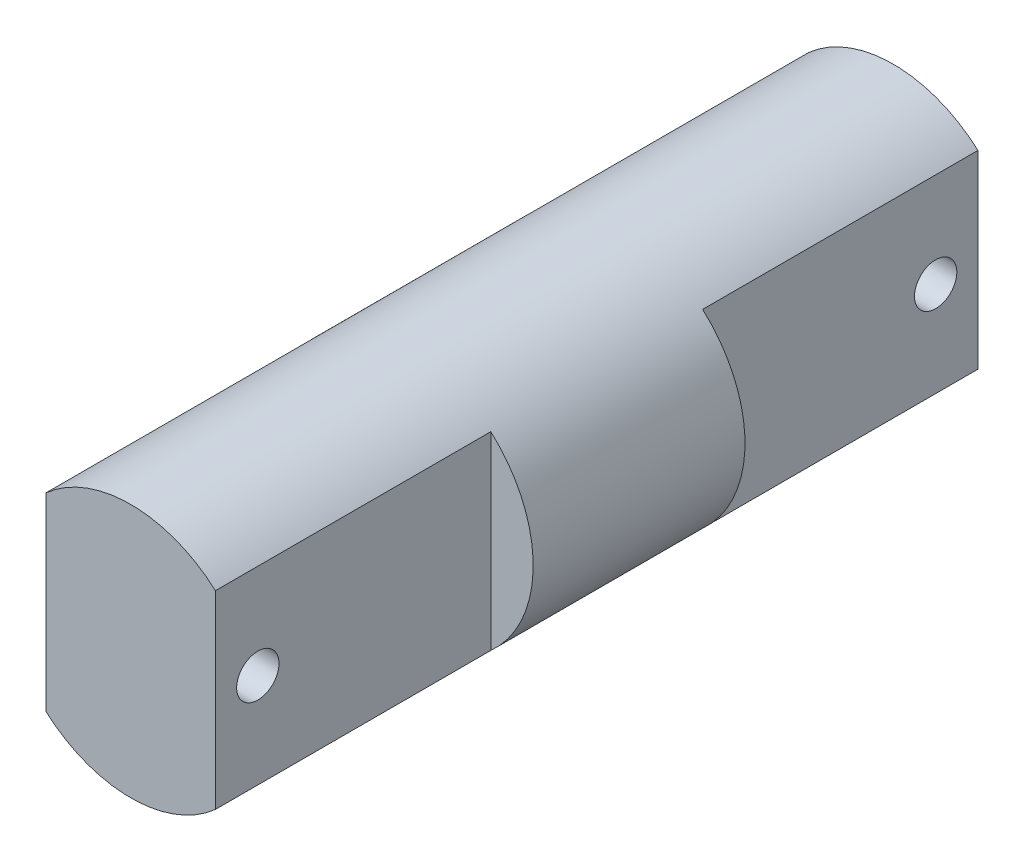
ISO-10303-21;
HEADER;
FILE_DESCRIPTION(('STEP AP214'),'2;1');
FILE_NAME('part.step','',(''),(''),'','','');
FILE_SCHEMA(('AUTOMOTIVE_DESIGN { 1 0 10303 214 1 1 1 1 }'));
ENDSEC;
DATA;
#1=APPLICATION_CONTEXT('core data for automotive mechanical design processes');
#2=APPLICATION_PROTOCOL_DEFINITION('international standard','automotive_design',2000,#1);
#3=PRODUCT_CONTEXT('',#1,'mechanical');
#4=PRODUCT('Part','Part','',(#3));
#5=PRODUCT_RELATED_PRODUCT_CATEGORY('part','',(#4));
#6=PRODUCT_DEFINITION_FORMATION('','',#4);
#7=PRODUCT_DEFINITION_CONTEXT('part definition',#1,'design');
#8=PRODUCT_DEFINITION('design','',#6,#7);
#9=PRODUCT_DEFINITION_SHAPE('','',#8);
#10=(LENGTH_UNIT() NAMED_UNIT(*) SI_UNIT(.MILLI.,.METRE.));
#11=(NAMED_UNIT(*) PLANE_ANGLE_UNIT() SI_UNIT($,.RADIAN.));
#12=(NAMED_UNIT(*) SI_UNIT($,.STERADIAN.) SOLID_ANGLE_UNIT());
#13=UNCERTAINTY_MEASURE_WITH_UNIT(LENGTH_MEASURE(1.E-05),#10,'distance_accuracy_value','');
#14=(GEOMETRIC_REPRESENTATION_CONTEXT(3) GLOBAL_UNCERTAINTY_ASSIGNED_CONTEXT((#13)) GLOBAL_UNIT_ASSIGNED_CONTEXT((#10,
#11,#12)) REPRESENTATION_CONTEXT('',''));
#15=CARTESIAN_POINT('',(0.,0.,0.));
#16=DIRECTION('',(0.,0.,1.));
#17=DIRECTION('',(1.,0.,0.));
#18=AXIS2_PLACEMENT_3D('',#15,#16,#17);
#19=CARTESIAN_POINT('',(0.,0.,-228.6));
#20=DIRECTION('',(0.,0.,1.));
#21=DIRECTION('',(1.,0.,0.));
#22=AXIS2_PLACEMENT_3D('',#19,#20,#21);
#23=CYLINDRICAL_SURFACE('',#22,38.1);
#24=CARTESIAN_POINT('',(0.,0.,0.));
#25=DIRECTION('',(0.,0.,1.));
#26=DIRECTION('',(1.,0.,0.));
#27=AXIS2_PLACEMENT_3D('',#24,#25,#26);
#28=CIRCLE('',#27,38.1);
#29=CARTESIAN_POINT('',(-25.4,-28.3980633142473,0.));
#30=VERTEX_POINT('',#29);
#31=CARTESIAN_POINT('',(25.4,-28.3980633142473,0.));
#32=VERTEX_POINT('',#31);
#33=EDGE_CURVE('E163',#30,#32,#28,.T.);
#34=ORIENTED_EDGE('',*,*,#33,.F.);
#35=DIRECTION('',(0.,0.,1.));
#36=VECTOR('',#35,1.);
#37=CARTESIAN_POINT('',(-25.4,-28.3980633142473,-228.6));
#38=LINE('',#37,#36);
#39=CARTESIAN_POINT('',(-25.4,-28.3980633142473,-82.55));
#40=VERTEX_POINT('',#39);
#41=EDGE_CURVE('E149',#30,#40,#38,.F.);
#42=ORIENTED_EDGE('',*,*,#41,.T.);
#43=CARTESIAN_POINT('',(0.,0.,-82.55));
#44=DIRECTION('',(0.,0.,-1.));
#45=DIRECTION('',(-1.,0.,0.));
#46=AXIS2_PLACEMENT_3D('',#43,#44,#45);
#47=CIRCLE('',#46,38.1);
#48=CARTESIAN_POINT('',(-25.4,28.3980633142473,-82.55));
#49=VERTEX_POINT('',#48);
#50=EDGE_CURVE('E182',#49,#40,#47,.F.);
#51=ORIENTED_EDGE('',*,*,#50,.F.);
#52=DIRECTION('',(0.,0.,1.));
#53=VECTOR('',#52,1.);
#54=CARTESIAN_POINT('',(-25.4,28.3980633142473,-228.6));
#55=LINE('',#54,#53);
#56=CARTESIAN_POINT('',(-25.4,28.3980633142473,0.));
#57=VERTEX_POINT('',#56);
#58=EDGE_CURVE('E145',#49,#57,#55,.T.);
#59=ORIENTED_EDGE('',*,*,#58,.T.);
#60=CARTESIAN_POINT('',(25.4,28.3980633142473,0.));
#61=VERTEX_POINT('',#60);
#62=EDGE_CURVE('E167',#61,#57,#28,.T.);
#63=ORIENTED_EDGE('',*,*,#62,.F.);
#64=DIRECTION('',(0.,0.,1.));
#65=VECTOR('',#64,1.);
#66=CARTESIAN_POINT('',(25.4,28.3980633142473,-228.6));
#67=LINE('',#66,#65);
#68=CARTESIAN_POINT('',(25.4,28.3980633142473,-82.55));
#69=VERTEX_POINT('',#68);
#70=EDGE_CURVE('E157',#69,#61,#67,.T.);
#71=ORIENTED_EDGE('',*,*,#70,.F.);
#72=CARTESIAN_POINT('',(0.,0.,-82.55));
#73=DIRECTION('',(0.,0.,1.));
#74=DIRECTION('',(1.,0.,0.));
#75=AXIS2_PLACEMENT_3D('',#72,#73,#74);
#76=CIRCLE('',#75,38.1);
#77=CARTESIAN_POINT('',(25.4,-28.3980633142473,-82.55));
#78=VERTEX_POINT('',#77);
#79=EDGE_CURVE('E174',#69,#78,#76,.F.);
#80=ORIENTED_EDGE('',*,*,#79,.T.);
#81=DIRECTION('',(0.,0.,1.));
#82=VECTOR('',#81,1.);
#83=CARTESIAN_POINT('',(25.4,-28.3980633142473,-228.6));
#84=LINE('',#83,#82);
#85=EDGE_CURVE('E160',#32,#78,#84,.F.);
#86=ORIENTED_EDGE('',*,*,#85,.F.);
#87=EDGE_LOOP('',(#34,#42,#51,#59,#63,#71,#80,#86));
#88=FACE_BOUND('',#87,.T.);
#89=CARTESIAN_POINT('',(0.,0.,-146.05));
#90=DIRECTION('',(0.,0.,-1.));
#91=DIRECTION('',(-1.,0.,0.));
#92=AXIS2_PLACEMENT_3D('',#89,#90,#91);
#93=CIRCLE('',#92,38.1);
#94=CARTESIAN_POINT('',(-25.4,28.3980633142473,-146.05));
#95=VERTEX_POINT('',#94);
#96=CARTESIAN_POINT('',(-25.4,-28.3980633142473,-146.05));
#97=VERTEX_POINT('',#96);
#98=EDGE_CURVE('E11',#95,#97,#93,.F.);
#99=ORIENTED_EDGE('',*,*,#98,.T.);
#100=DIRECTION('',(0.,0.,1.));
#101=VECTOR('',#100,1.);
#102=CARTESIAN_POINT('',(-25.4,-28.3980633142473,-228.6));
#103=LINE('',#102,#101);
#104=CARTESIAN_POINT('',(-25.4,-28.3980633142473,-228.6));
#105=VERTEX_POINT('',#104);
#106=EDGE_CURVE('E104',#97,#105,#103,.F.);
#107=ORIENTED_EDGE('',*,*,#106,.T.);
#108=CARTESIAN_POINT('',(0.,0.,-228.6));
#109=DIRECTION('',(0.,0.,1.));
#110=DIRECTION('',(1.,0.,0.));
#111=AXIS2_PLACEMENT_3D('',#108,#109,#110);
#112=CIRCLE('',#111,38.1);
#113=CARTESIAN_POINT('',(25.4,-28.3980633142473,-228.6));
#114=VERTEX_POINT('',#113);
#115=EDGE_CURVE('E62',#105,#114,#112,.T.);
#116=ORIENTED_EDGE('',*,*,#115,.T.);
#117=DIRECTION('',(0.,0.,1.));
#118=VECTOR('',#117,1.);
#119=CARTESIAN_POINT('',(25.4,-28.3980633142473,-228.6));
#120=LINE('',#119,#118);
#121=CARTESIAN_POINT('',(25.4,-28.3980633142473,-146.05));
#122=VERTEX_POINT('',#121);
#123=EDGE_CURVE('E130',#122,#114,#120,.F.);
#124=ORIENTED_EDGE('',*,*,#123,.F.);
#125=CARTESIAN_POINT('',(0.,0.,-146.05));
#126=DIRECTION('',(0.,0.,1.));
#127=DIRECTION('',(1.,0.,0.));
#128=AXIS2_PLACEMENT_3D('',#125,#126,#127);
#129=CIRCLE('',#128,38.1);
#130=CARTESIAN_POINT('',(25.4,28.3980633142473,-146.05));
#131=VERTEX_POINT('',#130);
#132=EDGE_CURVE('E189',#131,#122,#129,.F.);
#133=ORIENTED_EDGE('',*,*,#132,.F.);
#134=DIRECTION('',(0.,0.,1.));
#135=VECTOR('',#134,1.);
#136=CARTESIAN_POINT('',(25.4,28.3980633142473,-228.6));
#137=LINE('',#136,#135);
#138=CARTESIAN_POINT('',(25.4,28.3980633142473,-228.6));
#139=VERTEX_POINT('',#138);
#140=EDGE_CURVE('E127',#139,#131,#137,.T.);
#141=ORIENTED_EDGE('',*,*,#140,.F.);
#142=CARTESIAN_POINT('',(-25.4,28.3980633142473,-228.6));
#143=VERTEX_POINT('',#142);
#144=EDGE_CURVE('E119',#139,#143,#112,.T.);
#145=ORIENTED_EDGE('',*,*,#144,.T.);
#146=DIRECTION('',(0.,0.,1.));
#147=VECTOR('',#146,1.);
#148=CARTESIAN_POINT('',(-25.4,28.3980633142473,-228.6));
#149=LINE('',#148,#147);
#150=EDGE_CURVE('E54',#143,#95,#149,.T.);
#151=ORIENTED_EDGE('',*,*,#150,.T.);
#152=EDGE_LOOP('',(#99,#107,#116,#124,#133,#141,#145,#151));
#153=FACE_BOUND('',#152,.T.);
#154=ADVANCED_FACE('F39',(#88,#153),#23,.T.);
#155=CARTESIAN_POINT('',(0.,0.,-228.6));
#156=DIRECTION('',(0.,0.,1.));
#157=DIRECTION('',(1.,0.,0.));
#158=AXIS2_PLACEMENT_3D('',#155,#156,#157);
#159=PLANE('',#158);
#160=DIRECTION('',(0.,-1.,0.));
#161=VECTOR('',#160,1.);
#162=CARTESIAN_POINT('',(-25.4,0.,-228.6));
#163=LINE('',#162,#161);
#164=EDGE_CURVE('E47',#143,#105,#163,.T.);
#165=ORIENTED_EDGE('',*,*,#164,.F.);
#166=ORIENTED_EDGE('',*,*,#144,.F.);
#167=DIRECTION('',(0.,-1.,0.));
#168=VECTOR('',#167,1.);
#169=CARTESIAN_POINT('',(25.4,0.,-228.6));
#170=LINE('',#169,#168);
#171=EDGE_CURVE('E185',#139,#114,#170,.T.);
#172=ORIENTED_EDGE('',*,*,#171,.T.);
#173=ORIENTED_EDGE('',*,*,#115,.F.);
#174=EDGE_LOOP('',(#165,#166,#172,#173));
#175=FACE_BOUND('',#174,.T.);
#176=ADVANCED_FACE('F216',(#175),#159,.F.);
#177=CARTESIAN_POINT('',(0.,0.,0.));
#178=DIRECTION('',(0.,0.,1.));
#179=DIRECTION('',(1.,0.,0.));
#180=AXIS2_PLACEMENT_3D('',#177,#178,#179);
#181=PLANE('',#180);
#182=ORIENTED_EDGE('',*,*,#62,.T.);
#183=DIRECTION('',(0.,-1.,0.));
#184=VECTOR('',#183,1.);
#185=CARTESIAN_POINT('',(-25.4,0.,0.));
#186=LINE('',#185,#184);
#187=EDGE_CURVE('E178',#57,#30,#186,.T.);
#188=ORIENTED_EDGE('',*,*,#187,.T.);
#189=ORIENTED_EDGE('',*,*,#33,.T.);
#190=DIRECTION('',(0.,-1.,0.));
#191=VECTOR('',#190,1.);
#192=CARTESIAN_POINT('',(25.4,0.,0.));
#193=LINE('',#192,#191);
#194=EDGE_CURVE('E166',#61,#32,#193,.T.);
#195=ORIENTED_EDGE('',*,*,#194,.F.);
#196=EDGE_LOOP('',(#182,#188,#189,#195));
#197=FACE_BOUND('',#196,.T.);
#198=ADVANCED_FACE('F197',(#197),#181,.T.);
#199=CARTESIAN_POINT('',(50.8,-38.1,-82.55));
#200=DIRECTION('',(0.,0.,1.));
#201=DIRECTION('',(1.,0.,0.));
#202=AXIS2_PLACEMENT_3D('',#199,#200,#201);
#203=PLANE('',#202);
#204=DIRECTION('',(0.,1.,0.));
#205=VECTOR('',#204,1.);
#206=CARTESIAN_POINT('',(25.4,-38.1,-82.55));
#207=LINE('',#206,#205);
#208=EDGE_CURVE('E153',#78,#69,#207,.T.);
#209=ORIENTED_EDGE('',*,*,#208,.F.);
#210=ORIENTED_EDGE('',*,*,#79,.F.);
#211=EDGE_LOOP('',(#209,#210));
#212=FACE_BOUND('',#211,.T.);
#213=ADVANCED_FACE('F206',(#212),#203,.T.);
#214=CARTESIAN_POINT('',(25.4,0.,0.));
#215=DIRECTION('',(-1.,0.,0.));
#216=DIRECTION('',(0.,0.,1.));
#217=AXIS2_PLACEMENT_3D('',#214,#215,#216);
#218=PLANE('',#217);
#219=CARTESIAN_POINT('',(25.4,0.,-12.7));
#220=DIRECTION('',(1.,0.,0.));
#221=DIRECTION('',(0.,0.,-1.));
#222=AXIS2_PLACEMENT_3D('',#219,#220,#221);
#223=CIRCLE('',#222,6.35);
#224=CARTESIAN_POINT('',(25.4,0.,-19.05));
#225=VERTEX_POINT('',#224);
#226=EDGE_CURVE('E134',#225,#225,#223,.T.);
#227=ORIENTED_EDGE('',*,*,#226,.F.);
#228=EDGE_LOOP('',(#227));
#229=FACE_BOUND('',#228,.T.);
#230=ORIENTED_EDGE('',*,*,#85,.T.);
#231=ORIENTED_EDGE('',*,*,#208,.T.);
#232=ORIENTED_EDGE('',*,*,#70,.T.);
#233=ORIENTED_EDGE('',*,*,#194,.T.);
#234=EDGE_LOOP('',(#230,#231,#232,#233));
#235=FACE_BOUND('',#234,.T.);
#236=ADVANCED_FACE('F202',(#229,#235),#218,.F.);
#237=CARTESIAN_POINT('',(-50.8,-38.1,-82.55));
#238=DIRECTION('',(0.,0.,-1.));
#239=DIRECTION('',(-1.,0.,0.));
#240=AXIS2_PLACEMENT_3D('',#237,#238,#239);
#241=PLANE('',#240);
#242=ORIENTED_EDGE('',*,*,#50,.T.);
#243=DIRECTION('',(0.,1.,0.));
#244=VECTOR('',#243,1.);
#245=CARTESIAN_POINT('',(-25.4,-38.1,-82.55));
#246=LINE('',#245,#244);
#247=EDGE_CURVE('E138',#40,#49,#246,.T.);
#248=ORIENTED_EDGE('',*,*,#247,.T.);
#249=EDGE_LOOP('',(#242,#248));
#250=FACE_BOUND('',#249,.T.);
#251=ADVANCED_FACE('F213',(#250),#241,.F.);
#252=CARTESIAN_POINT('',(-25.4,0.,0.));
#253=DIRECTION('',(-1.,0.,0.));
#254=DIRECTION('',(0.,0.,1.));
#255=AXIS2_PLACEMENT_3D('',#252,#253,#254);
#256=PLANE('',#255);
#257=CARTESIAN_POINT('',(-25.4,0.,-12.7));
#258=DIRECTION('',(-1.,0.,0.));
#259=DIRECTION('',(0.,0.,1.));
#260=AXIS2_PLACEMENT_3D('',#257,#258,#259);
#261=CIRCLE('',#260,6.35);
#262=CARTESIAN_POINT('',(-25.4,0.,-6.35));
#263=VERTEX_POINT('',#262);
#264=EDGE_CURVE('E133',#263,#263,#261,.F.);
#265=ORIENTED_EDGE('',*,*,#264,.T.);
#266=EDGE_LOOP('',(#265));
#267=FACE_BOUND('',#266,.T.);
#268=ORIENTED_EDGE('',*,*,#187,.F.);
#269=ORIENTED_EDGE('',*,*,#58,.F.);
#270=ORIENTED_EDGE('',*,*,#247,.F.);
#271=ORIENTED_EDGE('',*,*,#41,.F.);
#272=EDGE_LOOP('',(#268,#269,#270,#271));
#273=FACE_BOUND('',#272,.T.);
#274=ADVANCED_FACE('F240',(#267,#273),#256,.T.);
#275=CARTESIAN_POINT('',(-38.101,0.,-12.7));
#276=DIRECTION('',(1.,0.,0.));
#277=DIRECTION('',(0.,0.,-1.));
#278=AXIS2_PLACEMENT_3D('',#275,#276,#277);
#279=CYLINDRICAL_SURFACE('',#278,6.35);
#280=ORIENTED_EDGE('',*,*,#264,.F.);
#281=EDGE_LOOP('',(#280));
#282=FACE_BOUND('',#281,.T.);
#283=ORIENTED_EDGE('',*,*,#226,.T.);
#284=EDGE_LOOP('',(#283));
#285=FACE_BOUND('',#284,.T.);
#286=ADVANCED_FACE('F232',(#282,#285),#279,.F.);
#287=CARTESIAN_POINT('',(50.8,-38.1,-146.05));
#288=DIRECTION('',(0.,0.,1.));
#289=DIRECTION('',(1.,0.,0.));
#290=AXIS2_PLACEMENT_3D('',#287,#288,#289);
#291=PLANE('',#290);
#292=ORIENTED_EDGE('',*,*,#132,.T.);
#293=DIRECTION('',(0.,1.,0.));
#294=VECTOR('',#293,1.);
#295=CARTESIAN_POINT('',(25.4,-38.1,-146.05));
#296=LINE('',#295,#294);
#297=EDGE_CURVE('E109',#122,#131,#296,.T.);
#298=ORIENTED_EDGE('',*,*,#297,.T.);
#299=EDGE_LOOP('',(#292,#298));
#300=FACE_BOUND('',#299,.T.);
#301=ADVANCED_FACE('F230',(#300),#291,.F.);
#302=CARTESIAN_POINT('',(25.4,0.,-228.6));
#303=DIRECTION('',(-1.,0.,0.));
#304=DIRECTION('',(0.,0.,-1.));
#305=AXIS2_PLACEMENT_3D('',#302,#303,#304);
#306=PLANE('',#305);
#307=CARTESIAN_POINT('',(25.4,0.,-215.9));
#308=DIRECTION('',(-1.,0.,0.));
#309=DIRECTION('',(0.,0.,1.));
#310=AXIS2_PLACEMENT_3D('',#307,#308,#309);
#311=CIRCLE('',#310,6.35);
#312=CARTESIAN_POINT('',(25.4,0.,-209.55));
#313=VERTEX_POINT('',#312);
#314=EDGE_CURVE('E319',#313,#313,#311,.T.);
#315=ORIENTED_EDGE('',*,*,#314,.T.);
#316=EDGE_LOOP('',(#315));
#317=FACE_BOUND('',#316,.T.);
#318=ORIENTED_EDGE('',*,*,#123,.T.);
#319=ORIENTED_EDGE('',*,*,#171,.F.);
#320=ORIENTED_EDGE('',*,*,#140,.T.);
#321=ORIENTED_EDGE('',*,*,#297,.F.);
#322=EDGE_LOOP('',(#318,#319,#320,#321));
#323=FACE_BOUND('',#322,.T.);
#324=ADVANCED_FACE('F226',(#317,#323),#306,.F.);
#325=CARTESIAN_POINT('',(-50.8,-38.1,-146.05));
#326=DIRECTION('',(0.,0.,-1.));
#327=DIRECTION('',(-1.,0.,0.));
#328=AXIS2_PLACEMENT_3D('',#325,#326,#327);
#329=PLANE('',#328);
#330=DIRECTION('',(0.,1.,0.));
#331=VECTOR('',#330,1.);
#332=CARTESIAN_POINT('',(-25.4,-38.1,-146.05));
#333=LINE('',#332,#331);
#334=EDGE_CURVE('E107',#97,#95,#333,.T.);
#335=ORIENTED_EDGE('',*,*,#334,.F.);
#336=ORIENTED_EDGE('',*,*,#98,.F.);
#337=EDGE_LOOP('',(#335,#336));
#338=FACE_BOUND('',#337,.T.);
#339=ADVANCED_FACE('F112',(#338),#329,.T.);
#340=CARTESIAN_POINT('',(-25.4,0.,-228.6));
#341=DIRECTION('',(-1.,0.,0.));
#342=DIRECTION('',(0.,0.,-1.));
#343=AXIS2_PLACEMENT_3D('',#340,#341,#342);
#344=PLANE('',#343);
#345=CARTESIAN_POINT('',(-25.4,0.,-215.9));
#346=DIRECTION('',(-1.,0.,0.));
#347=DIRECTION('',(0.,0.,1.));
#348=AXIS2_PLACEMENT_3D('',#345,#346,#347);
#349=CIRCLE('',#348,6.35);
#350=CARTESIAN_POINT('',(-25.4,0.,-209.55));
#351=VERTEX_POINT('',#350);
#352=EDGE_CURVE('E114',#351,#351,#349,.T.);
#353=ORIENTED_EDGE('',*,*,#352,.F.);
#354=EDGE_LOOP('',(#353));
#355=FACE_BOUND('',#354,.T.);
#356=ORIENTED_EDGE('',*,*,#334,.T.);
#357=ORIENTED_EDGE('',*,*,#150,.F.);
#358=ORIENTED_EDGE('',*,*,#164,.T.);
#359=ORIENTED_EDGE('',*,*,#106,.F.);
#360=EDGE_LOOP('',(#356,#357,#358,#359));
#361=FACE_BOUND('',#360,.T.);
#362=ADVANCED_FACE('F106',(#355,#361),#344,.T.);
#363=CARTESIAN_POINT('',(-38.101,0.,-215.9));
#364=DIRECTION('',(1.,0.,0.));
#365=DIRECTION('',(0.,0.,-1.));
#366=AXIS2_PLACEMENT_3D('',#363,#364,#365);
#367=CYLINDRICAL_SURFACE('',#366,6.35);
#368=ORIENTED_EDGE('',*,*,#352,.T.);
#369=EDGE_LOOP('',(#368));
#370=FACE_BOUND('',#369,.T.);
#371=ORIENTED_EDGE('',*,*,#314,.F.);
#372=EDGE_LOOP('',(#371));
#373=FACE_BOUND('',#372,.T.);
#374=ADVANCED_FACE('F300',(#370,#373),#367,.F.);
#375=CLOSED_SHELL('',(#154,#176,#198,#213,#236,#251,#274,#286,#301,#324,#339,#362,#374));
#376=MANIFOLD_SOLID_BREP('B2',#375);
#377=ADVANCED_BREP_SHAPE_REPRESENTATION('',(#18,#376),#14);
#378=SHAPE_DEFINITION_REPRESENTATION(#9,#377);
ENDSEC;
END-ISO-10303-21;
